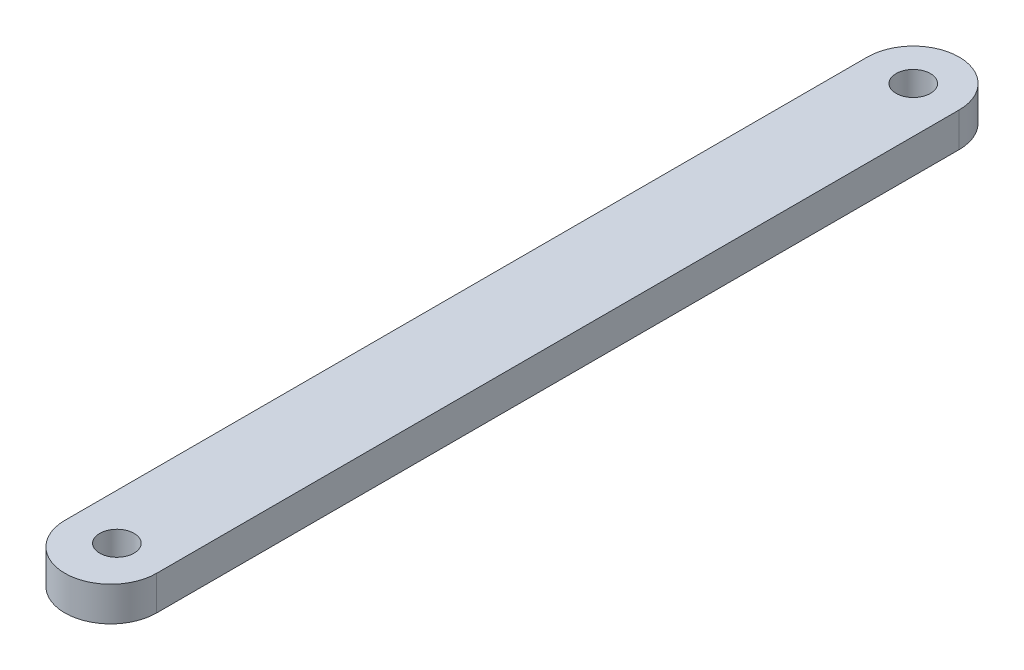
ISO-10303-21;
HEADER;
FILE_DESCRIPTION(('STEP AP214'),'2;1');
FILE_NAME('part.step','',(''),(''),'','','');
FILE_SCHEMA(('AUTOMOTIVE_DESIGN { 1 0 10303 214 1 1 1 1 }'));
ENDSEC;
DATA;
#1=APPLICATION_CONTEXT('core data for automotive mechanical design processes');
#2=APPLICATION_PROTOCOL_DEFINITION('international standard','automotive_design',2000,#1);
#3=PRODUCT_CONTEXT('',#1,'mechanical');
#4=PRODUCT('Part','Part','',(#3));
#5=PRODUCT_RELATED_PRODUCT_CATEGORY('part','',(#4));
#6=PRODUCT_DEFINITION_FORMATION('','',#4);
#7=PRODUCT_DEFINITION_CONTEXT('part definition',#1,'design');
#8=PRODUCT_DEFINITION('design','',#6,#7);
#9=PRODUCT_DEFINITION_SHAPE('','',#8);
#10=(LENGTH_UNIT() NAMED_UNIT(*) SI_UNIT(.MILLI.,.METRE.));
#11=(NAMED_UNIT(*) PLANE_ANGLE_UNIT() SI_UNIT($,.RADIAN.));
#12=(NAMED_UNIT(*) SI_UNIT($,.STERADIAN.) SOLID_ANGLE_UNIT());
#13=UNCERTAINTY_MEASURE_WITH_UNIT(LENGTH_MEASURE(1.E-05),#10,'distance_accuracy_value','');
#14=(GEOMETRIC_REPRESENTATION_CONTEXT(3) GLOBAL_UNCERTAINTY_ASSIGNED_CONTEXT((#13)) GLOBAL_UNIT_ASSIGNED_CONTEXT((#10,
#11,#12)) REPRESENTATION_CONTEXT('',''));
#15=CARTESIAN_POINT('',(0.,0.,0.));
#16=DIRECTION('',(0.,0.,1.));
#17=DIRECTION('',(1.,0.,0.));
#18=AXIS2_PLACEMENT_3D('',#15,#16,#17);
#19=CARTESIAN_POINT('',(41811.5434985447,-401.439495489949,36.5));
#20=DIRECTION('',(0.,-1.,0.));
#21=DIRECTION('',(1.,0.,0.));
#22=AXIS2_PLACEMENT_3D('',#19,#20,#21);
#23=PLANE('',#22);
#24=CARTESIAN_POINT('',(41811.5431403264,-401.439495489949,35.9646732904949));
#25=DIRECTION('',(0.,-1.,0.));
#26=DIRECTION('',(1.,0.,0.));
#27=AXIS2_PLACEMENT_3D('',#24,#25,#26);
#28=CIRCLE('',#27,1.50000000000178);
#29=CARTESIAN_POINT('',(41813.0431403264,-401.439495489949,35.9646732904949));
#30=VERTEX_POINT('',#29);
#31=EDGE_CURVE('E105',#30,#30,#28,.T.);
#32=ORIENTED_EDGE('',*,*,#31,.F.);
#33=EDGE_LOOP('',(#32));
#34=FACE_BOUND('',#33,.T.);
#35=CARTESIAN_POINT('',(41811.5434985447,-401.439495489949,36.5));
#36=DIRECTION('',(0.,-1.,0.));
#37=DIRECTION('',(1.,0.,0.));
#38=AXIS2_PLACEMENT_3D('',#35,#36,#37);
#39=CIRCLE('',#38,3.99999999999778);
#40=CARTESIAN_POINT('',(41815.5434985447,-401.439495489949,36.5));
#41=VERTEX_POINT('',#40);
#42=CARTESIAN_POINT('',(41807.5434985447,-401.439495489949,36.5));
#43=VERTEX_POINT('',#42);
#44=EDGE_CURVE('E90',#41,#43,#39,.T.);
#45=ORIENTED_EDGE('',*,*,#44,.T.);
#46=DIRECTION('',(0.,0.,-1.));
#47=VECTOR('',#46,1.);
#48=CARTESIAN_POINT('',(41807.5434985447,-401.439495489949,36.5));
#49=LINE('',#48,#47);
#50=CARTESIAN_POINT('',(41807.5434985447,-401.439495489949,-33.5));
#51=VERTEX_POINT('',#50);
#52=EDGE_CURVE('E85',#43,#51,#49,.T.);
#53=ORIENTED_EDGE('',*,*,#52,.T.);
#54=CARTESIAN_POINT('',(41811.5434985447,-401.439495489949,-33.5));
#55=DIRECTION('',(0.,-1.,0.));
#56=DIRECTION('',(1.,0.,0.));
#57=AXIS2_PLACEMENT_3D('',#54,#55,#56);
#58=CIRCLE('',#57,3.99999999999778);
#59=CARTESIAN_POINT('',(41815.5434985447,-401.439495489949,-33.5));
#60=VERTEX_POINT('',#59);
#61=EDGE_CURVE('E88',#51,#60,#58,.T.);
#62=ORIENTED_EDGE('',*,*,#61,.T.);
#63=DIRECTION('',(0.,0.,1.));
#64=VECTOR('',#63,1.);
#65=CARTESIAN_POINT('',(41815.5434985447,-401.439495489949,36.5));
#66=LINE('',#65,#64);
#67=EDGE_CURVE('E55',#60,#41,#66,.T.);
#68=ORIENTED_EDGE('',*,*,#67,.T.);
#69=EDGE_LOOP('',(#45,#53,#62,#68));
#70=FACE_BOUND('',#69,.T.);
#71=CARTESIAN_POINT('',(41811.5434985447,-401.439495489949,-33.5));
#72=DIRECTION('',(0.,-1.,0.));
#73=DIRECTION('',(1.,0.,0.));
#74=AXIS2_PLACEMENT_3D('',#71,#72,#73);
#75=CIRCLE('',#74,1.50000000000178);
#76=CARTESIAN_POINT('',(41813.0434985447,-401.439495489949,-33.5));
#77=VERTEX_POINT('',#76);
#78=EDGE_CURVE('E120',#77,#77,#75,.T.);
#79=ORIENTED_EDGE('',*,*,#78,.F.);
#80=EDGE_LOOP('',(#79));
#81=FACE_BOUND('',#80,.T.);
#82=ADVANCED_FACE('F38',(#34,#70,#81),#23,.T.);
#83=CARTESIAN_POINT('',(41811.5434985447,-398.439495489949,36.5));
#84=DIRECTION('',(0.,-1.,0.));
#85=DIRECTION('',(1.,0.,0.));
#86=AXIS2_PLACEMENT_3D('',#83,#84,#85);
#87=PLANE('',#86);
#88=CARTESIAN_POINT('',(41811.5434985447,-398.439495489949,36.5));
#89=DIRECTION('',(0.,-1.,0.));
#90=DIRECTION('',(1.,0.,0.));
#91=AXIS2_PLACEMENT_3D('',#88,#89,#90);
#92=CIRCLE('',#91,3.99999999999778);
#93=CARTESIAN_POINT('',(41815.5434985447,-398.439495489949,36.5));
#94=VERTEX_POINT('',#93);
#95=CARTESIAN_POINT('',(41807.5434985447,-398.439495489949,36.5));
#96=VERTEX_POINT('',#95);
#97=EDGE_CURVE('E102',#94,#96,#92,.T.);
#98=ORIENTED_EDGE('',*,*,#97,.F.);
#99=DIRECTION('',(0.,0.,1.));
#100=VECTOR('',#99,1.);
#101=CARTESIAN_POINT('',(41815.5434985447,-398.439495489949,36.5));
#102=LINE('',#101,#100);
#103=CARTESIAN_POINT('',(41815.5434985447,-398.439495489949,-33.5));
#104=VERTEX_POINT('',#103);
#105=EDGE_CURVE('E78',#104,#94,#102,.T.);
#106=ORIENTED_EDGE('',*,*,#105,.F.);
#107=CARTESIAN_POINT('',(41811.5434985447,-398.439495489949,-33.5));
#108=DIRECTION('',(0.,-1.,0.));
#109=DIRECTION('',(1.,0.,0.));
#110=AXIS2_PLACEMENT_3D('',#107,#108,#109);
#111=CIRCLE('',#110,3.99999999999778);
#112=CARTESIAN_POINT('',(41807.5434985447,-398.439495489949,-33.5));
#113=VERTEX_POINT('',#112);
#114=EDGE_CURVE('E72',#113,#104,#111,.T.);
#115=ORIENTED_EDGE('',*,*,#114,.F.);
#116=DIRECTION('',(0.,0.,-1.));
#117=VECTOR('',#116,1.);
#118=CARTESIAN_POINT('',(41807.5434985447,-398.439495489949,36.5));
#119=LINE('',#118,#117);
#120=EDGE_CURVE('E94',#96,#113,#119,.T.);
#121=ORIENTED_EDGE('',*,*,#120,.F.);
#122=EDGE_LOOP('',(#98,#106,#115,#121));
#123=FACE_BOUND('',#122,.T.);
#124=CARTESIAN_POINT('',(41811.5431403264,-398.439495489949,35.9646732904949));
#125=DIRECTION('',(0.,-1.,0.));
#126=DIRECTION('',(1.,0.,0.));
#127=AXIS2_PLACEMENT_3D('',#124,#125,#126);
#128=CIRCLE('',#127,1.50000000000178);
#129=CARTESIAN_POINT('',(41813.0431403264,-398.439495489949,35.9646732904949));
#130=VERTEX_POINT('',#129);
#131=EDGE_CURVE('E117',#130,#130,#128,.T.);
#132=ORIENTED_EDGE('',*,*,#131,.T.);
#133=EDGE_LOOP('',(#132));
#134=FACE_BOUND('',#133,.T.);
#135=CARTESIAN_POINT('',(41811.5434985447,-398.439495489949,-33.5));
#136=DIRECTION('',(0.,-1.,0.));
#137=DIRECTION('',(1.,0.,0.));
#138=AXIS2_PLACEMENT_3D('',#135,#136,#137);
#139=CIRCLE('',#138,1.50000000000178);
#140=CARTESIAN_POINT('',(41813.0434985447,-398.439495489949,-33.5));
#141=VERTEX_POINT('',#140);
#142=EDGE_CURVE('E123',#141,#141,#139,.T.);
#143=ORIENTED_EDGE('',*,*,#142,.T.);
#144=EDGE_LOOP('',(#143));
#145=FACE_BOUND('',#144,.T.);
#146=ADVANCED_FACE('F113',(#123,#134,#145),#87,.F.);
#147=CARTESIAN_POINT('',(41811.5434985447,-401.439495489949,36.5));
#148=DIRECTION('',(0.,1.,0.));
#149=DIRECTION('',(-1.,0.,0.));
#150=AXIS2_PLACEMENT_3D('',#147,#148,#149);
#151=CYLINDRICAL_SURFACE('',#150,3.99999999999778);
#152=ORIENTED_EDGE('',*,*,#97,.T.);
#153=DIRECTION('',(0.,1.,0.));
#154=VECTOR('',#153,1.);
#155=CARTESIAN_POINT('',(41807.5434985447,-401.439495489949,36.5));
#156=LINE('',#155,#154);
#157=EDGE_CURVE('E11',#43,#96,#156,.T.);
#158=ORIENTED_EDGE('',*,*,#157,.F.);
#159=ORIENTED_EDGE('',*,*,#44,.F.);
#160=DIRECTION('',(0.,1.,0.));
#161=VECTOR('',#160,1.);
#162=CARTESIAN_POINT('',(41815.5434985447,-401.439495489949,36.5));
#163=LINE('',#162,#161);
#164=EDGE_CURVE('E98',#41,#94,#163,.T.);
#165=ORIENTED_EDGE('',*,*,#164,.T.);
#166=EDGE_LOOP('',(#152,#158,#159,#165));
#167=FACE_BOUND('',#166,.T.);
#168=ADVANCED_FACE('F40',(#167),#151,.T.);
#169=CARTESIAN_POINT('',(41807.5434985447,-401.439495489949,36.5));
#170=DIRECTION('',(1.,0.,0.));
#171=DIRECTION('',(0.,1.,0.));
#172=AXIS2_PLACEMENT_3D('',#169,#170,#171);
#173=PLANE('',#172);
#174=ORIENTED_EDGE('',*,*,#120,.T.);
#175=DIRECTION('',(0.,1.,0.));
#176=VECTOR('',#175,1.);
#177=CARTESIAN_POINT('',(41807.5434985447,-401.439495489949,-33.5));
#178=LINE('',#177,#176);
#179=EDGE_CURVE('E47',#51,#113,#178,.T.);
#180=ORIENTED_EDGE('',*,*,#179,.F.);
#181=ORIENTED_EDGE('',*,*,#52,.F.);
#182=ORIENTED_EDGE('',*,*,#157,.T.);
#183=EDGE_LOOP('',(#174,#180,#181,#182));
#184=FACE_BOUND('',#183,.T.);
#185=ADVANCED_FACE('F93',(#184),#173,.F.);
#186=CARTESIAN_POINT('',(41811.5434985447,-401.439495489949,-33.5));
#187=DIRECTION('',(0.,1.,0.));
#188=DIRECTION('',(-1.,0.,0.));
#189=AXIS2_PLACEMENT_3D('',#186,#187,#188);
#190=CYLINDRICAL_SURFACE('',#189,3.99999999999778);
#191=ORIENTED_EDGE('',*,*,#114,.T.);
#192=DIRECTION('',(0.,1.,0.));
#193=VECTOR('',#192,1.);
#194=CARTESIAN_POINT('',(41815.5434985447,-401.439495489949,-33.5));
#195=LINE('',#194,#193);
#196=EDGE_CURVE('E95',#60,#104,#195,.T.);
#197=ORIENTED_EDGE('',*,*,#196,.F.);
#198=ORIENTED_EDGE('',*,*,#61,.F.);
#199=ORIENTED_EDGE('',*,*,#179,.T.);
#200=EDGE_LOOP('',(#191,#197,#198,#199));
#201=FACE_BOUND('',#200,.T.);
#202=ADVANCED_FACE('F96',(#201),#190,.T.);
#203=CARTESIAN_POINT('',(41815.5434985447,-401.439495489949,36.5));
#204=DIRECTION('',(-1.,0.,0.));
#205=DIRECTION('',(0.,-1.,0.));
#206=AXIS2_PLACEMENT_3D('',#203,#204,#205);
#207=PLANE('',#206);
#208=ORIENTED_EDGE('',*,*,#105,.T.);
#209=ORIENTED_EDGE('',*,*,#164,.F.);
#210=ORIENTED_EDGE('',*,*,#67,.F.);
#211=ORIENTED_EDGE('',*,*,#196,.T.);
#212=EDGE_LOOP('',(#208,#209,#210,#211));
#213=FACE_BOUND('',#212,.T.);
#214=ADVANCED_FACE('F110',(#213),#207,.F.);
#215=CARTESIAN_POINT('',(41811.5431403264,-401.439495489949,35.9646732904949));
#216=DIRECTION('',(0.,1.,0.));
#217=DIRECTION('',(-1.,0.,0.));
#218=AXIS2_PLACEMENT_3D('',#215,#216,#217);
#219=CYLINDRICAL_SURFACE('',#218,1.50000000000178);
#220=ORIENTED_EDGE('',*,*,#31,.T.);
#221=EDGE_LOOP('',(#220));
#222=FACE_BOUND('',#221,.T.);
#223=ORIENTED_EDGE('',*,*,#131,.F.);
#224=EDGE_LOOP('',(#223));
#225=FACE_BOUND('',#224,.T.);
#226=ADVANCED_FACE('F140',(#222,#225),#219,.F.);
#227=CARTESIAN_POINT('',(41811.5434985447,-401.439495489949,-33.5));
#228=DIRECTION('',(0.,1.,0.));
#229=DIRECTION('',(-1.,0.,0.));
#230=AXIS2_PLACEMENT_3D('',#227,#228,#229);
#231=CYLINDRICAL_SURFACE('',#230,1.50000000000178);
#232=ORIENTED_EDGE('',*,*,#78,.T.);
#233=EDGE_LOOP('',(#232));
#234=FACE_BOUND('',#233,.T.);
#235=ORIENTED_EDGE('',*,*,#142,.F.);
#236=EDGE_LOOP('',(#235));
#237=FACE_BOUND('',#236,.T.);
#238=ADVANCED_FACE('F129',(#234,#237),#231,.F.);
#239=CLOSED_SHELL('',(#82,#146,#168,#185,#202,#214,#226,#238));
#240=MANIFOLD_SOLID_BREP('B2',#239);
#241=ADVANCED_BREP_SHAPE_REPRESENTATION('',(#18,#240),#14);
#242=SHAPE_DEFINITION_REPRESENTATION(#9,#241);
ENDSEC;
END-ISO-10303-21;
